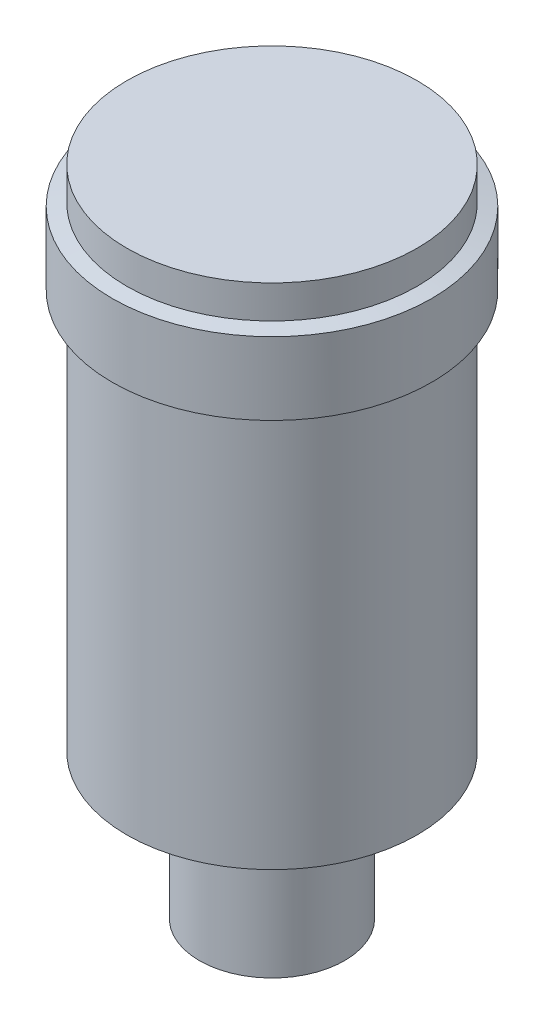
ISO-10303-21;
HEADER;
FILE_DESCRIPTION(('STEP AP214'),'2;1');
FILE_NAME('part.step','',(''),(''),'','','');
FILE_SCHEMA(('AUTOMOTIVE_DESIGN { 1 0 10303 214 1 1 1 1 }'));
ENDSEC;
DATA;
#1=APPLICATION_CONTEXT('core data for automotive mechanical design processes');
#2=APPLICATION_PROTOCOL_DEFINITION('international standard','automotive_design',2000,#1);
#3=PRODUCT_CONTEXT('',#1,'mechanical');
#4=PRODUCT('Part','Part','',(#3));
#5=PRODUCT_RELATED_PRODUCT_CATEGORY('part','',(#4));
#6=PRODUCT_DEFINITION_FORMATION('','',#4);
#7=PRODUCT_DEFINITION_CONTEXT('part definition',#1,'design');
#8=PRODUCT_DEFINITION('design','',#6,#7);
#9=PRODUCT_DEFINITION_SHAPE('','',#8);
#10=(LENGTH_UNIT() NAMED_UNIT(*) SI_UNIT(.MILLI.,.METRE.));
#11=(NAMED_UNIT(*) PLANE_ANGLE_UNIT() SI_UNIT($,.RADIAN.));
#12=(NAMED_UNIT(*) SI_UNIT($,.STERADIAN.) SOLID_ANGLE_UNIT());
#13=UNCERTAINTY_MEASURE_WITH_UNIT(LENGTH_MEASURE(1.E-05),#10,'distance_accuracy_value','');
#14=(GEOMETRIC_REPRESENTATION_CONTEXT(3) GLOBAL_UNCERTAINTY_ASSIGNED_CONTEXT((#13)) GLOBAL_UNIT_ASSIGNED_CONTEXT((#10,
#11,#12)) REPRESENTATION_CONTEXT('',''));
#15=CARTESIAN_POINT('',(0.,0.,0.));
#16=DIRECTION('',(0.,0.,1.));
#17=DIRECTION('',(1.,0.,0.));
#18=AXIS2_PLACEMENT_3D('',#15,#16,#17);
#19=CARTESIAN_POINT('',(0.,9.,0.));
#20=DIRECTION('',(0.,-1.,0.));
#21=DIRECTION('',(0.,0.,-1.));
#22=AXIS2_PLACEMENT_3D('',#19,#20,#21);
#23=CYLINDRICAL_SURFACE('',#22,2.);
#24=CARTESIAN_POINT('',(0.,2.,0.));
#25=DIRECTION('',(0.,1.,0.));
#26=DIRECTION('',(0.,0.,1.));
#27=AXIS2_PLACEMENT_3D('',#24,#25,#26);
#28=CIRCLE('',#27,2.);
#29=CARTESIAN_POINT('',(0.,2.,2.));
#30=VERTEX_POINT('',#29);
#31=EDGE_CURVE('E55',#30,#30,#28,.T.);
#32=ORIENTED_EDGE('',*,*,#31,.T.);
#33=EDGE_LOOP('',(#32));
#34=FACE_BOUND('',#33,.T.);
#35=CARTESIAN_POINT('',(0.,7.45454545454545,0.));
#36=DIRECTION('',(0.,1.,0.));
#37=DIRECTION('',(0.,0.,1.));
#38=AXIS2_PLACEMENT_3D('',#35,#36,#37);
#39=CIRCLE('',#38,2.);
#40=CARTESIAN_POINT('',(0.,7.45454545454545,2.));
#41=VERTEX_POINT('',#40);
#42=EDGE_CURVE('E41',#41,#41,#39,.T.);
#43=ORIENTED_EDGE('',*,*,#42,.F.);
#44=EDGE_LOOP('',(#43));
#45=FACE_BOUND('',#44,.T.);
#46=ADVANCED_FACE('F34',(#34,#45),#23,.T.);
#47=CARTESIAN_POINT('',(0.,2.,0.));
#48=DIRECTION('',(0.,-1.,0.));
#49=DIRECTION('',(0.,0.,-1.));
#50=AXIS2_PLACEMENT_3D('',#47,#48,#49);
#51=CYLINDRICAL_SURFACE('',#50,1.);
#52=CARTESIAN_POINT('',(0.,2.,0.));
#53=DIRECTION('',(0.,1.,0.));
#54=DIRECTION('',(0.,0.,1.));
#55=AXIS2_PLACEMENT_3D('',#52,#53,#54);
#56=CIRCLE('',#55,1.);
#57=CARTESIAN_POINT('',(0.,2.,1.));
#58=VERTEX_POINT('',#57);
#59=EDGE_CURVE('E58',#58,#58,#56,.T.);
#60=ORIENTED_EDGE('',*,*,#59,.F.);
#61=EDGE_LOOP('',(#60));
#62=FACE_BOUND('',#61,.T.);
#63=CARTESIAN_POINT('',(0.,0.,0.));
#64=DIRECTION('',(0.,1.,0.));
#65=DIRECTION('',(0.,0.,1.));
#66=AXIS2_PLACEMENT_3D('',#63,#64,#65);
#67=CIRCLE('',#66,1.);
#68=CARTESIAN_POINT('',(0.,0.,1.));
#69=VERTEX_POINT('',#68);
#70=EDGE_CURVE('E54',#69,#69,#67,.T.);
#71=ORIENTED_EDGE('',*,*,#70,.T.);
#72=EDGE_LOOP('',(#71));
#73=FACE_BOUND('',#72,.T.);
#74=ADVANCED_FACE('F36',(#62,#73),#51,.T.);
#75=CARTESIAN_POINT('',(0.,0.,0.));
#76=DIRECTION('',(0.,1.,0.));
#77=DIRECTION('',(0.,0.,1.));
#78=AXIS2_PLACEMENT_3D('',#75,#76,#77);
#79=PLANE('',#78);
#80=ORIENTED_EDGE('',*,*,#70,.F.);
#81=EDGE_LOOP('',(#80));
#82=FACE_BOUND('',#81,.T.);
#83=ADVANCED_FACE('F78',(#82),#79,.F.);
#84=CARTESIAN_POINT('',(0.,2.,0.));
#85=DIRECTION('',(0.,1.,0.));
#86=DIRECTION('',(0.,0.,1.));
#87=AXIS2_PLACEMENT_3D('',#84,#85,#86);
#88=PLANE('',#87);
#89=ORIENTED_EDGE('',*,*,#59,.T.);
#90=EDGE_LOOP('',(#89));
#91=FACE_BOUND('',#90,.T.);
#92=ORIENTED_EDGE('',*,*,#31,.F.);
#93=EDGE_LOOP('',(#92));
#94=FACE_BOUND('',#93,.T.);
#95=ADVANCED_FACE('F89',(#91,#94),#88,.F.);
#96=CARTESIAN_POINT('',(0.,8.5,0.));
#97=DIRECTION('',(0.,-1.,0.));
#98=DIRECTION('',(0.,0.,-1.));
#99=AXIS2_PLACEMENT_3D('',#96,#97,#98);
#100=CONICAL_SURFACE('',#99,2.2,1.34731972565426);
#101=CARTESIAN_POINT('',(0.,8.5,0.));
#102=DIRECTION('',(0.,1.,0.));
#103=DIRECTION('',(0.,0.,1.));
#104=AXIS2_PLACEMENT_3D('',#101,#102,#103);
#105=CIRCLE('',#104,2.2);
#106=CARTESIAN_POINT('',(0.,8.5,2.2));
#107=VERTEX_POINT('',#106);
#108=EDGE_CURVE('E107',#107,#107,#105,.T.);
#109=ORIENTED_EDGE('',*,*,#108,.T.);
#110=EDGE_LOOP('',(#109));
#111=FACE_BOUND('',#110,.T.);
#112=CARTESIAN_POINT('',(0.,8.54545454545454,0.));
#113=DIRECTION('',(0.,-1.,0.));
#114=DIRECTION('',(0.,0.,-1.));
#115=AXIS2_PLACEMENT_3D('',#112,#113,#114);
#116=CIRCLE('',#115,2.);
#117=CARTESIAN_POINT('',(0.,8.54545454545454,-2.));
#118=VERTEX_POINT('',#117);
#119=EDGE_CURVE('E11',#118,#118,#116,.T.);
#120=ORIENTED_EDGE('',*,*,#119,.T.);
#121=EDGE_LOOP('',(#120));
#122=FACE_BOUND('',#121,.T.);
#123=ADVANCED_FACE('F87',(#111,#122),#100,.T.);
#124=CARTESIAN_POINT('',(0.,7.,0.));
#125=DIRECTION('',(0.,1.,0.));
#126=DIRECTION('',(0.,0.,1.));
#127=AXIS2_PLACEMENT_3D('',#124,#125,#126);
#128=CONICAL_SURFACE('',#127,0.,1.34731972565426);
#129=CARTESIAN_POINT('',(0.,7.5,0.));
#130=DIRECTION('',(0.,1.,0.));
#131=DIRECTION('',(0.,0.,1.));
#132=AXIS2_PLACEMENT_3D('',#129,#130,#131);
#133=CIRCLE('',#132,2.2);
#134=CARTESIAN_POINT('',(0.,7.5,2.2));
#135=VERTEX_POINT('',#134);
#136=EDGE_CURVE('E61',#135,#135,#133,.T.);
#137=ORIENTED_EDGE('',*,*,#136,.F.);
#138=EDGE_LOOP('',(#137));
#139=FACE_BOUND('',#138,.T.);
#140=ORIENTED_EDGE('',*,*,#42,.T.);
#141=EDGE_LOOP('',(#140));
#142=FACE_BOUND('',#141,.T.);
#143=ADVANCED_FACE('F70',(#139,#142),#128,.T.);
#144=CARTESIAN_POINT('',(0.,9.,0.));
#145=DIRECTION('',(0.,1.,0.));
#146=DIRECTION('',(0.,0.,1.));
#147=AXIS2_PLACEMENT_3D('',#144,#145,#146);
#148=CYLINDRICAL_SURFACE('',#147,2.2);
#149=ORIENTED_EDGE('',*,*,#108,.F.);
#150=EDGE_LOOP('',(#149));
#151=FACE_BOUND('',#150,.T.);
#152=ORIENTED_EDGE('',*,*,#136,.T.);
#153=EDGE_LOOP('',(#152));
#154=FACE_BOUND('',#153,.T.);
#155=ADVANCED_FACE('F48',(#151,#154),#148,.T.);
#156=CARTESIAN_POINT('',(0.,9.,0.));
#157=DIRECTION('',(0.,1.,0.));
#158=DIRECTION('',(0.,0.,1.));
#159=AXIS2_PLACEMENT_3D('',#156,#157,#158);
#160=PLANE('',#159);
#161=CARTESIAN_POINT('',(0.,9.,0.));
#162=VERTEX_POINT('',#161);
#163=VERTEX_LOOP('',#162);
#164=FACE_BOUND('',#163,.T.);
#165=CARTESIAN_POINT('',(0.,9.,0.));
#166=DIRECTION('',(0.,1.,0.));
#167=DIRECTION('',(0.,0.,1.));
#168=AXIS2_PLACEMENT_3D('',#165,#166,#167);
#169=CIRCLE('',#168,2.);
#170=CARTESIAN_POINT('',(0.,9.,2.));
#171=VERTEX_POINT('',#170);
#172=EDGE_CURVE('E52',#171,#171,#169,.T.);
#173=ORIENTED_EDGE('',*,*,#172,.T.);
#174=EDGE_LOOP('',(#173));
#175=FACE_BOUND('',#174,.T.);
#176=ADVANCED_FACE('F44',(#164,#175),#160,.T.);
#177=ORIENTED_EDGE('',*,*,#172,.F.);
#178=EDGE_LOOP('',(#177));
#179=FACE_BOUND('',#178,.T.);
#180=ORIENTED_EDGE('',*,*,#119,.F.);
#181=EDGE_LOOP('',(#180));
#182=FACE_BOUND('',#181,.T.);
#183=ADVANCED_FACE('F47',(#179,#182),#23,.T.);
#184=CLOSED_SHELL('',(#46,#74,#83,#95,#123,#143,#155,#176,#183));
#185=MANIFOLD_SOLID_BREP('B2',#184);
#186=ADVANCED_BREP_SHAPE_REPRESENTATION('',(#18,#185),#14);
#187=SHAPE_DEFINITION_REPRESENTATION(#9,#186);
ENDSEC;
END-ISO-10303-21;
